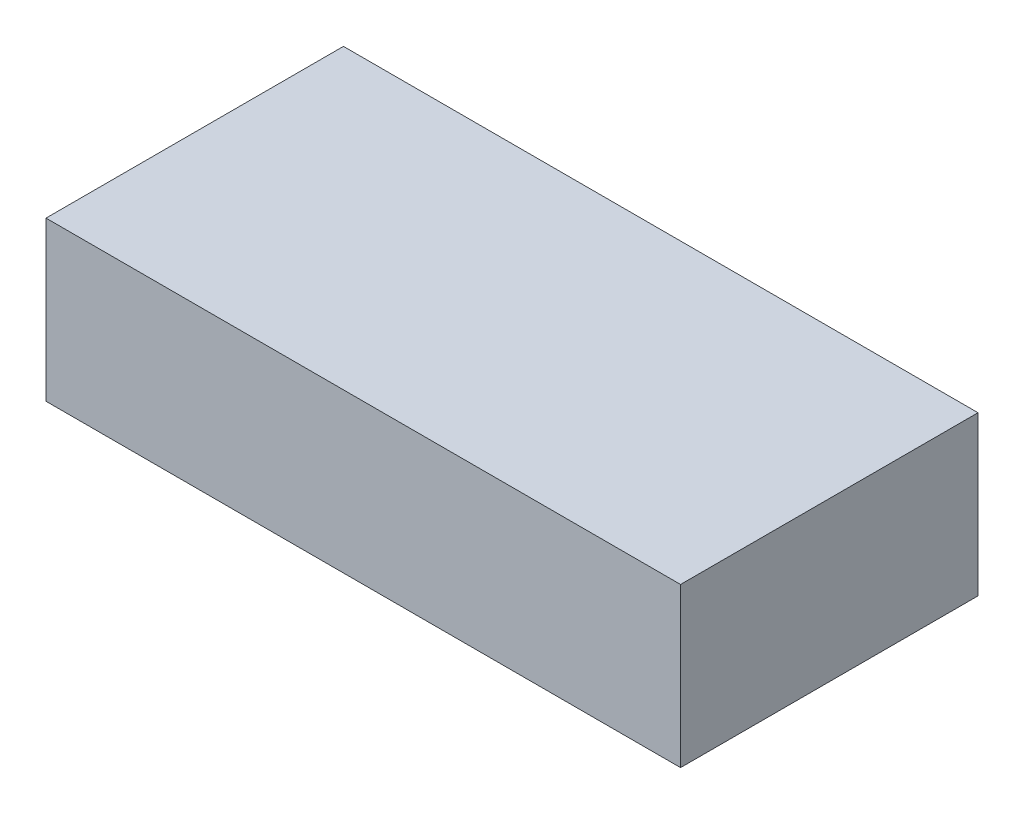
ISO-10303-21;
HEADER;
FILE_DESCRIPTION(('STEP AP214'),'2;1');
FILE_NAME('part.step','',(''),(''),'','','');
FILE_SCHEMA(('AUTOMOTIVE_DESIGN { 1 0 10303 214 1 1 1 1 }'));
ENDSEC;
DATA;
#1=APPLICATION_CONTEXT('core data for automotive mechanical design processes');
#2=APPLICATION_PROTOCOL_DEFINITION('international standard','automotive_design',2000,#1);
#3=PRODUCT_CONTEXT('',#1,'mechanical');
#4=PRODUCT('Part','Part','',(#3));
#5=PRODUCT_RELATED_PRODUCT_CATEGORY('part','',(#4));
#6=PRODUCT_DEFINITION_FORMATION('','',#4);
#7=PRODUCT_DEFINITION_CONTEXT('part definition',#1,'design');
#8=PRODUCT_DEFINITION('design','',#6,#7);
#9=PRODUCT_DEFINITION_SHAPE('','',#8);
#10=(LENGTH_UNIT() NAMED_UNIT(*) SI_UNIT(.MILLI.,.METRE.));
#11=(NAMED_UNIT(*) PLANE_ANGLE_UNIT() SI_UNIT($,.RADIAN.));
#12=(NAMED_UNIT(*) SI_UNIT($,.STERADIAN.) SOLID_ANGLE_UNIT());
#13=UNCERTAINTY_MEASURE_WITH_UNIT(LENGTH_MEASURE(1.E-05),#10,'distance_accuracy_value','');
#14=(GEOMETRIC_REPRESENTATION_CONTEXT(3) GLOBAL_UNCERTAINTY_ASSIGNED_CONTEXT((#13)) GLOBAL_UNIT_ASSIGNED_CONTEXT((#10,
#11,#12)) REPRESENTATION_CONTEXT('',''));
#15=CARTESIAN_POINT('',(0.,0.,0.));
#16=DIRECTION('',(0.,0.,1.));
#17=DIRECTION('',(1.,0.,0.));
#18=AXIS2_PLACEMENT_3D('',#15,#16,#17);
#19=CARTESIAN_POINT('',(16.,4.,7.5));
#20=DIRECTION('',(-1.,0.,0.));
#21=DIRECTION('',(0.,0.,1.));
#22=AXIS2_PLACEMENT_3D('',#19,#20,#21);
#23=PLANE('',#22);
#24=DIRECTION('',(0.,0.,-1.));
#25=VECTOR('',#24,1.);
#26=CARTESIAN_POINT('',(16.,-4.,7.5));
#27=LINE('',#26,#25);
#28=CARTESIAN_POINT('',(16.,-4.,7.5));
#29=VERTEX_POINT('',#28);
#30=CARTESIAN_POINT('',(16.,-4.,-7.5));
#31=VERTEX_POINT('',#30);
#32=EDGE_CURVE('E104',#29,#31,#27,.T.);
#33=ORIENTED_EDGE('',*,*,#32,.T.);
#34=DIRECTION('',(0.,-1.,0.));
#35=VECTOR('',#34,1.);
#36=CARTESIAN_POINT('',(16.,4.,-7.5));
#37=LINE('',#36,#35);
#38=CARTESIAN_POINT('',(16.,4.,-7.5));
#39=VERTEX_POINT('',#38);
#40=EDGE_CURVE('E11',#39,#31,#37,.T.);
#41=ORIENTED_EDGE('',*,*,#40,.F.);
#42=DIRECTION('',(0.,0.,-1.));
#43=VECTOR('',#42,1.);
#44=CARTESIAN_POINT('',(16.,4.,7.5));
#45=LINE('',#44,#43);
#46=CARTESIAN_POINT('',(16.,4.,7.5));
#47=VERTEX_POINT('',#46);
#48=EDGE_CURVE('E92',#47,#39,#45,.T.);
#49=ORIENTED_EDGE('',*,*,#48,.F.);
#50=DIRECTION('',(0.,-1.,0.));
#51=VECTOR('',#50,1.);
#52=CARTESIAN_POINT('',(16.,4.,7.5));
#53=LINE('',#52,#51);
#54=EDGE_CURVE('E100',#47,#29,#53,.T.);
#55=ORIENTED_EDGE('',*,*,#54,.T.);
#56=EDGE_LOOP('',(#33,#41,#49,#55));
#57=FACE_BOUND('',#56,.T.);
#58=ADVANCED_FACE('F41',(#57),#23,.F.);
#59=CARTESIAN_POINT('',(-16.,4.,-7.5));
#60=DIRECTION('',(0.,0.,1.));
#61=DIRECTION('',(1.,0.,0.));
#62=AXIS2_PLACEMENT_3D('',#59,#60,#61);
#63=PLANE('',#62);
#64=DIRECTION('',(-1.,0.,0.));
#65=VECTOR('',#64,1.);
#66=CARTESIAN_POINT('',(-16.,-4.,-7.5));
#67=LINE('',#66,#65);
#68=CARTESIAN_POINT('',(-16.,-4.,-7.5));
#69=VERTEX_POINT('',#68);
#70=EDGE_CURVE('E96',#31,#69,#67,.T.);
#71=ORIENTED_EDGE('',*,*,#70,.T.);
#72=DIRECTION('',(0.,-1.,0.));
#73=VECTOR('',#72,1.);
#74=CARTESIAN_POINT('',(-16.,4.,-7.5));
#75=LINE('',#74,#73);
#76=CARTESIAN_POINT('',(-16.,4.,-7.5));
#77=VERTEX_POINT('',#76);
#78=EDGE_CURVE('E49',#77,#69,#75,.T.);
#79=ORIENTED_EDGE('',*,*,#78,.F.);
#80=DIRECTION('',(-1.,0.,0.));
#81=VECTOR('',#80,1.);
#82=CARTESIAN_POINT('',(-16.,4.,-7.5));
#83=LINE('',#82,#81);
#84=EDGE_CURVE('E87',#39,#77,#83,.T.);
#85=ORIENTED_EDGE('',*,*,#84,.F.);
#86=ORIENTED_EDGE('',*,*,#40,.T.);
#87=EDGE_LOOP('',(#71,#79,#85,#86));
#88=FACE_BOUND('',#87,.T.);
#89=ADVANCED_FACE('F95',(#88),#63,.F.);
#90=CARTESIAN_POINT('',(-16.,4.,7.5));
#91=DIRECTION('',(1.,0.,0.));
#92=DIRECTION('',(0.,0.,-1.));
#93=AXIS2_PLACEMENT_3D('',#90,#91,#92);
#94=PLANE('',#93);
#95=DIRECTION('',(0.,0.,1.));
#96=VECTOR('',#95,1.);
#97=CARTESIAN_POINT('',(-16.,-4.,7.5));
#98=LINE('',#97,#96);
#99=CARTESIAN_POINT('',(-16.,-4.,7.5));
#100=VERTEX_POINT('',#99);
#101=EDGE_CURVE('E74',#69,#100,#98,.T.);
#102=ORIENTED_EDGE('',*,*,#101,.T.);
#103=DIRECTION('',(0.,-1.,0.));
#104=VECTOR('',#103,1.);
#105=CARTESIAN_POINT('',(-16.,4.,7.5));
#106=LINE('',#105,#104);
#107=CARTESIAN_POINT('',(-16.,4.,7.5));
#108=VERTEX_POINT('',#107);
#109=EDGE_CURVE('E97',#108,#100,#106,.T.);
#110=ORIENTED_EDGE('',*,*,#109,.F.);
#111=DIRECTION('',(0.,0.,1.));
#112=VECTOR('',#111,1.);
#113=CARTESIAN_POINT('',(-16.,4.,7.5));
#114=LINE('',#113,#112);
#115=EDGE_CURVE('E90',#77,#108,#114,.T.);
#116=ORIENTED_EDGE('',*,*,#115,.F.);
#117=ORIENTED_EDGE('',*,*,#78,.T.);
#118=EDGE_LOOP('',(#102,#110,#116,#117));
#119=FACE_BOUND('',#118,.T.);
#120=ADVANCED_FACE('F98',(#119),#94,.F.);
#121=CARTESIAN_POINT('',(-16.,4.,7.5));
#122=DIRECTION('',(0.,0.,-1.));
#123=DIRECTION('',(-1.,0.,0.));
#124=AXIS2_PLACEMENT_3D('',#121,#122,#123);
#125=PLANE('',#124);
#126=DIRECTION('',(1.,0.,0.));
#127=VECTOR('',#126,1.);
#128=CARTESIAN_POINT('',(-16.,-4.,7.5));
#129=LINE('',#128,#127);
#130=EDGE_CURVE('E80',#100,#29,#129,.T.);
#131=ORIENTED_EDGE('',*,*,#130,.T.);
#132=ORIENTED_EDGE('',*,*,#54,.F.);
#133=DIRECTION('',(1.,0.,0.));
#134=VECTOR('',#133,1.);
#135=CARTESIAN_POINT('',(-16.,4.,7.5));
#136=LINE('',#135,#134);
#137=EDGE_CURVE('E57',#108,#47,#136,.T.);
#138=ORIENTED_EDGE('',*,*,#137,.F.);
#139=ORIENTED_EDGE('',*,*,#109,.T.);
#140=EDGE_LOOP('',(#131,#132,#138,#139));
#141=FACE_BOUND('',#140,.T.);
#142=ADVANCED_FACE('F111',(#141),#125,.F.);
#143=CARTESIAN_POINT('',(0.,4.,0.));
#144=DIRECTION('',(0.,-1.,0.));
#145=DIRECTION('',(0.,0.,-1.));
#146=AXIS2_PLACEMENT_3D('',#143,#144,#145);
#147=PLANE('',#146);
#148=ORIENTED_EDGE('',*,*,#48,.T.);
#149=ORIENTED_EDGE('',*,*,#84,.T.);
#150=ORIENTED_EDGE('',*,*,#115,.T.);
#151=ORIENTED_EDGE('',*,*,#137,.T.);
#152=EDGE_LOOP('',(#148,#149,#150,#151));
#153=FACE_BOUND('',#152,.T.);
#154=ADVANCED_FACE('F88',(#153),#147,.F.);
#155=CARTESIAN_POINT('',(0.,-4.,0.));
#156=DIRECTION('',(0.,-1.,0.));
#157=DIRECTION('',(0.,0.,-1.));
#158=AXIS2_PLACEMENT_3D('',#155,#156,#157);
#159=PLANE('',#158);
#160=ORIENTED_EDGE('',*,*,#32,.F.);
#161=ORIENTED_EDGE('',*,*,#130,.F.);
#162=ORIENTED_EDGE('',*,*,#101,.F.);
#163=ORIENTED_EDGE('',*,*,#70,.F.);
#164=EDGE_LOOP('',(#160,#161,#162,#163));
#165=FACE_BOUND('',#164,.T.);
#166=ADVANCED_FACE('F114',(#165),#159,.T.);
#167=CLOSED_SHELL('',(#58,#89,#120,#142,#154,#166));
#168=MANIFOLD_SOLID_BREP('B2',#167);
#169=ADVANCED_BREP_SHAPE_REPRESENTATION('',(#18,#168),#14);
#170=SHAPE_DEFINITION_REPRESENTATION(#9,#169);
ENDSEC;
END-ISO-10303-21;
